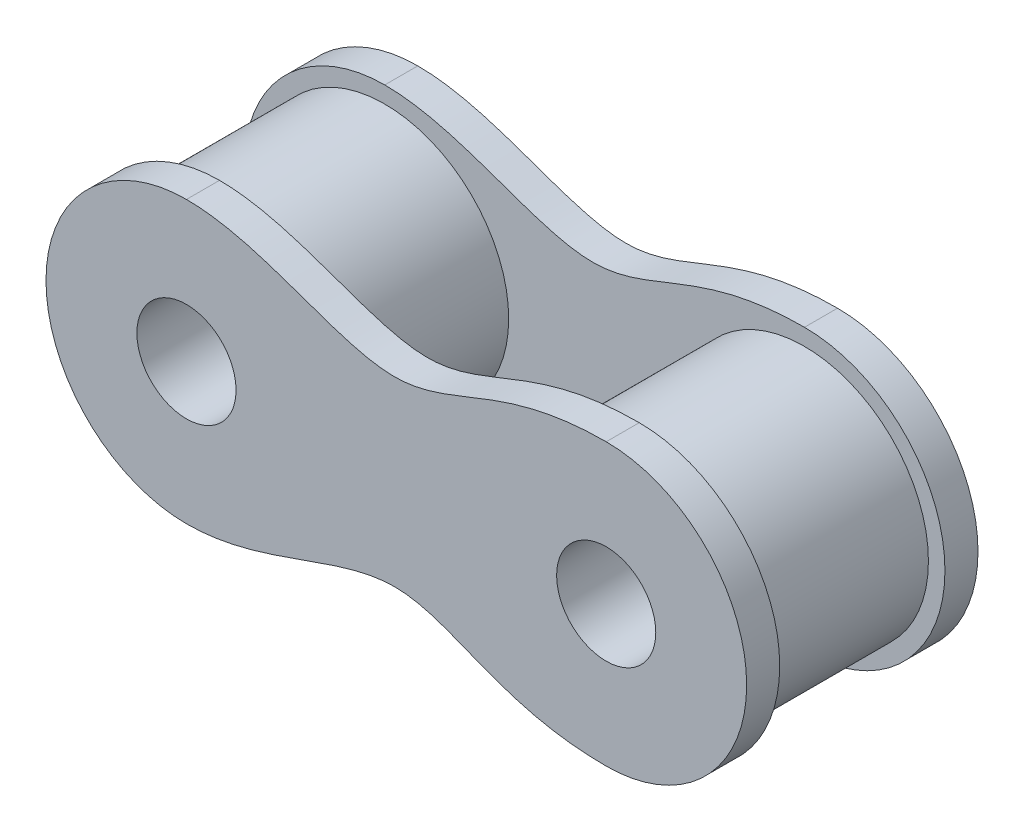
ISO-10303-21;
HEADER;
FILE_DESCRIPTION(('STEP AP214'),'2;1');
FILE_NAME('part.step','',(''),(''),'','','');
FILE_SCHEMA(('AUTOMOTIVE_DESIGN { 1 0 10303 214 1 1 1 1 }'));
ENDSEC;
DATA;
#1=APPLICATION_CONTEXT('core data for automotive mechanical design processes');
#2=APPLICATION_PROTOCOL_DEFINITION('international standard','automotive_design',2000,#1);
#3=PRODUCT_CONTEXT('',#1,'mechanical');
#4=PRODUCT('Part','Part','',(#3));
#5=PRODUCT_RELATED_PRODUCT_CATEGORY('part','',(#4));
#6=PRODUCT_DEFINITION_FORMATION('','',#4);
#7=PRODUCT_DEFINITION_CONTEXT('part definition',#1,'design');
#8=PRODUCT_DEFINITION('design','',#6,#7);
#9=PRODUCT_DEFINITION_SHAPE('','',#8);
#10=(LENGTH_UNIT() NAMED_UNIT(*) SI_UNIT(.MILLI.,.METRE.));
#11=(NAMED_UNIT(*) PLANE_ANGLE_UNIT() SI_UNIT($,.RADIAN.));
#12=(NAMED_UNIT(*) SI_UNIT($,.STERADIAN.) SOLID_ANGLE_UNIT());
#13=UNCERTAINTY_MEASURE_WITH_UNIT(LENGTH_MEASURE(1.E-05),#10,'distance_accuracy_value','');
#14=(GEOMETRIC_REPRESENTATION_CONTEXT(3) GLOBAL_UNCERTAINTY_ASSIGNED_CONTEXT((#13)) GLOBAL_UNIT_ASSIGNED_CONTEXT((#10,
#11,#12)) REPRESENTATION_CONTEXT('',''));
#15=CARTESIAN_POINT('',(0.,0.,0.));
#16=DIRECTION('',(0.,0.,1.));
#17=DIRECTION('',(1.,0.,0.));
#18=AXIS2_PLACEMENT_3D('',#15,#16,#17);
#19=CARTESIAN_POINT('',(6.3296493184956,-2.74999026126694,5.));
#20=DIRECTION('',(0.,0.,-1.));
#21=DIRECTION('',(-1.,0.,0.));
#22=AXIS2_PLACEMENT_3D('',#19,#20,#21);
#23=PLANE('',#22);
#24=CARTESIAN_POINT('',(0.,-4.25,5.));
#25=CARTESIAN_POINT('',(2.28904014641197,-4.25,5.));
#26=CARTESIAN_POINT('',(6.75768016733715,-1.24933243087643,5.));
#27=CARTESIAN_POINT('',(9.40838170625121,-4.25,5.));
#28=CARTESIAN_POINT('',(12.7,-4.25,5.));
#29=B_SPLINE_CURVE_WITH_KNOTS('',3,(#24,#25,#26,#27,#28),.UNSPECIFIED.,.F.,.F.,(4,1,4),(0.,
0.492542226610754,1.),.UNSPECIFIED.);
#30=CARTESIAN_POINT('',(0.,-4.25,5.));
#31=VERTEX_POINT('',#30);
#32=CARTESIAN_POINT('',(12.7,-4.25,5.));
#33=VERTEX_POINT('',#32);
#34=EDGE_CURVE('E208',#31,#33,#29,.T.);
#35=ORIENTED_EDGE('',*,*,#34,.F.);
#36=CARTESIAN_POINT('',(0.,0.,5.));
#37=DIRECTION('',(0.,0.,1.));
#38=DIRECTION('',(1.,0.,0.));
#39=AXIS2_PLACEMENT_3D('',#36,#37,#38);
#40=CIRCLE('',#39,4.25);
#41=CARTESIAN_POINT('',(0.,4.25,5.));
#42=VERTEX_POINT('',#41);
#43=EDGE_CURVE('E81',#42,#31,#40,.T.);
#44=ORIENTED_EDGE('',*,*,#43,.F.);
#45=CARTESIAN_POINT('',(12.7,4.25,5.));
#46=CARTESIAN_POINT('',(9.40838170625121,4.25,5.));
#47=CARTESIAN_POINT('',(6.75768016733715,1.24933243087643,5.));
#48=CARTESIAN_POINT('',(2.28904014641197,4.25,5.));
#49=CARTESIAN_POINT('',(0.,4.25,5.));
#50=B_SPLINE_CURVE_WITH_KNOTS('',3,(#45,#46,#47,#48,#49),.UNSPECIFIED.,.F.,.F.,(4,1,4),(0.,
0.507457773389246,1.),.UNSPECIFIED.);
#51=CARTESIAN_POINT('',(12.7,4.25,5.));
#52=VERTEX_POINT('',#51);
#53=EDGE_CURVE('E75',#52,#42,#50,.T.);
#54=ORIENTED_EDGE('',*,*,#53,.F.);
#55=CARTESIAN_POINT('',(12.7,0.,5.));
#56=DIRECTION('',(0.,0.,1.));
#57=DIRECTION('',(1.,0.,0.));
#58=AXIS2_PLACEMENT_3D('',#55,#56,#57);
#59=CIRCLE('',#58,4.25);
#60=EDGE_CURVE('E265',#33,#52,#59,.T.);
#61=ORIENTED_EDGE('',*,*,#60,.F.);
#62=EDGE_LOOP('',(#35,#44,#54,#61));
#63=FACE_BOUND('',#62,.T.);
#64=CARTESIAN_POINT('',(0.,0.,5.));
#65=DIRECTION('',(0.,0.,1.));
#66=DIRECTION('',(1.,0.,0.));
#67=AXIS2_PLACEMENT_3D('',#64,#65,#66);
#68=CIRCLE('',#67,3.75);
#69=CARTESIAN_POINT('',(3.75,0.,5.));
#70=VERTEX_POINT('',#69);
#71=EDGE_CURVE('E11',#70,#70,#68,.T.);
#72=ORIENTED_EDGE('',*,*,#71,.T.);
#73=EDGE_LOOP('',(#72));
#74=FACE_BOUND('',#73,.T.);
#75=CARTESIAN_POINT('',(12.7,0.,5.));
#76=DIRECTION('',(0.,0.,1.));
#77=DIRECTION('',(1.,0.,0.));
#78=AXIS2_PLACEMENT_3D('',#75,#76,#77);
#79=CIRCLE('',#78,3.75);
#80=CARTESIAN_POINT('',(16.45,0.,5.));
#81=VERTEX_POINT('',#80);
#82=EDGE_CURVE('E199',#81,#81,#79,.T.);
#83=ORIENTED_EDGE('',*,*,#82,.T.);
#84=EDGE_LOOP('',(#83));
#85=FACE_BOUND('',#84,.T.);
#86=ADVANCED_FACE('F39',(#63,#74,#85),#23,.T.);
#87=CARTESIAN_POINT('',(0.,0.,5.));
#88=DIRECTION('',(0.,0.,-1.));
#89=DIRECTION('',(-1.,0.,0.));
#90=AXIS2_PLACEMENT_3D('',#87,#88,#89);
#91=CYLINDRICAL_SURFACE('',#90,3.75);
#92=ORIENTED_EDGE('',*,*,#71,.F.);
#93=EDGE_LOOP('',(#92));
#94=FACE_BOUND('',#93,.T.);
#95=CARTESIAN_POINT('',(0.,0.,0.));
#96=DIRECTION('',(0.,0.,1.));
#97=DIRECTION('',(1.,0.,0.));
#98=AXIS2_PLACEMENT_3D('',#95,#96,#97);
#99=CIRCLE('',#98,3.75);
#100=CARTESIAN_POINT('',(3.75,0.,0.));
#101=VERTEX_POINT('',#100);
#102=EDGE_CURVE('E43',#101,#101,#99,.T.);
#103=ORIENTED_EDGE('',*,*,#102,.T.);
#104=EDGE_LOOP('',(#103));
#105=FACE_BOUND('',#104,.T.);
#106=ADVANCED_FACE('F41',(#94,#105),#91,.T.);
#107=CARTESIAN_POINT('',(0.,0.,5.));
#108=DIRECTION('',(0.,0.,-1.));
#109=DIRECTION('',(-1.,0.,0.));
#110=AXIS2_PLACEMENT_3D('',#107,#108,#109);
#111=CYLINDRICAL_SURFACE('',#110,1.5);
#112=CARTESIAN_POINT('',(0.,0.,6.));
#113=DIRECTION('',(0.,0.,1.));
#114=DIRECTION('',(1.,0.,0.));
#115=AXIS2_PLACEMENT_3D('',#112,#113,#114);
#116=CIRCLE('',#115,1.5);
#117=CARTESIAN_POINT('',(1.5,0.,6.));
#118=VERTEX_POINT('',#117);
#119=EDGE_CURVE('E202',#118,#118,#116,.T.);
#120=ORIENTED_EDGE('',*,*,#119,.T.);
#121=EDGE_LOOP('',(#120));
#122=FACE_BOUND('',#121,.T.);
#123=CARTESIAN_POINT('',(0.,0.,-1.));
#124=DIRECTION('',(0.,0.,-1.));
#125=DIRECTION('',(-1.,0.,0.));
#126=AXIS2_PLACEMENT_3D('',#123,#124,#125);
#127=CIRCLE('',#126,1.5);
#128=CARTESIAN_POINT('',(-1.5,0.,-1.));
#129=VERTEX_POINT('',#128);
#130=EDGE_CURVE('E173',#129,#129,#127,.T.);
#131=ORIENTED_EDGE('',*,*,#130,.T.);
#132=EDGE_LOOP('',(#131));
#133=FACE_BOUND('',#132,.T.);
#134=ADVANCED_FACE('F226',(#122,#133),#111,.F.);
#135=CARTESIAN_POINT('',(6.3296493184956,-2.74999026126694,6.));
#136=DIRECTION('',(0.,0.,-1.));
#137=DIRECTION('',(-1.,0.,0.));
#138=AXIS2_PLACEMENT_3D('',#135,#136,#137);
#139=PLANE('',#138);
#140=CARTESIAN_POINT('',(0.,-4.25,6.));
#141=CARTESIAN_POINT('',(2.28904014641197,-4.25,6.));
#142=CARTESIAN_POINT('',(6.75768016733715,-1.24933243087643,6.));
#143=CARTESIAN_POINT('',(9.40838170625121,-4.25,6.));
#144=CARTESIAN_POINT('',(12.7,-4.25,6.));
#145=B_SPLINE_CURVE_WITH_KNOTS('',3,(#140,#141,#142,#143,#144),.UNSPECIFIED.,.F.,.F.,(4,1,4),
(0.,0.492542226610754,1.),.UNSPECIFIED.);
#146=CARTESIAN_POINT('',(0.,-4.25,6.));
#147=VERTEX_POINT('',#146);
#148=CARTESIAN_POINT('',(12.7,-4.25,6.));
#149=VERTEX_POINT('',#148);
#150=EDGE_CURVE('E209',#147,#149,#145,.T.);
#151=ORIENTED_EDGE('',*,*,#150,.T.);
#152=CARTESIAN_POINT('',(12.7,0.,6.));
#153=DIRECTION('',(0.,0.,1.));
#154=DIRECTION('',(1.,0.,0.));
#155=AXIS2_PLACEMENT_3D('',#152,#153,#154);
#156=CIRCLE('',#155,4.25);
#157=CARTESIAN_POINT('',(12.7,4.25,6.));
#158=VERTEX_POINT('',#157);
#159=EDGE_CURVE('E89',#149,#158,#156,.T.);
#160=ORIENTED_EDGE('',*,*,#159,.T.);
#161=CARTESIAN_POINT('',(12.7,4.25,6.));
#162=CARTESIAN_POINT('',(9.40838170625121,4.25,6.));
#163=CARTESIAN_POINT('',(6.75768016733715,1.24933243087643,6.));
#164=CARTESIAN_POINT('',(2.28904014641197,4.25,6.));
#165=CARTESIAN_POINT('',(0.,4.25,6.));
#166=B_SPLINE_CURVE_WITH_KNOTS('',3,(#161,#162,#163,#164,#165),.UNSPECIFIED.,.F.,.F.,(4,1,4),
(0.,0.507457773389246,1.),.UNSPECIFIED.);
#167=CARTESIAN_POINT('',(0.,4.25,6.));
#168=VERTEX_POINT('',#167);
#169=EDGE_CURVE('E251',#158,#168,#166,.T.);
#170=ORIENTED_EDGE('',*,*,#169,.T.);
#171=CARTESIAN_POINT('',(0.,0.,6.));
#172=DIRECTION('',(0.,0.,1.));
#173=DIRECTION('',(1.,0.,0.));
#174=AXIS2_PLACEMENT_3D('',#171,#172,#173);
#175=CIRCLE('',#174,4.25);
#176=EDGE_CURVE('E57',#168,#147,#175,.T.);
#177=ORIENTED_EDGE('',*,*,#176,.T.);
#178=EDGE_LOOP('',(#151,#160,#170,#177));
#179=FACE_BOUND('',#178,.T.);
#180=CARTESIAN_POINT('',(12.7,0.,6.));
#181=DIRECTION('',(0.,0.,1.));
#182=DIRECTION('',(1.,0.,0.));
#183=AXIS2_PLACEMENT_3D('',#180,#181,#182);
#184=CIRCLE('',#183,1.5);
#185=CARTESIAN_POINT('',(14.2,0.,6.));
#186=VERTEX_POINT('',#185);
#187=EDGE_CURVE('E205',#186,#186,#184,.T.);
#188=ORIENTED_EDGE('',*,*,#187,.F.);
#189=EDGE_LOOP('',(#188));
#190=FACE_BOUND('',#189,.T.);
#191=ORIENTED_EDGE('',*,*,#119,.F.);
#192=EDGE_LOOP('',(#191));
#193=FACE_BOUND('',#192,.T.);
#194=ADVANCED_FACE('F223',(#179,#190,#193),#139,.F.);
#195=DIRECTION('',(0.,0.,-1.));
#196=VECTOR('',#195,1.);
#197=SURFACE_OF_LINEAR_EXTRUSION('',#145,#196);
#198=ORIENTED_EDGE('',*,*,#34,.T.);
#199=DIRECTION('',(0.,0.,-1.));
#200=VECTOR('',#199,1.);
#201=CARTESIAN_POINT('',(12.7,-4.25,6.));
#202=LINE('',#201,#200);
#203=EDGE_CURVE('E49',#149,#33,#202,.T.);
#204=ORIENTED_EDGE('',*,*,#203,.F.);
#205=ORIENTED_EDGE('',*,*,#150,.F.);
#206=DIRECTION('',(0.,0.,-1.));
#207=VECTOR('',#206,1.);
#208=CARTESIAN_POINT('',(0.,-4.25,6.));
#209=LINE('',#208,#207);
#210=EDGE_CURVE('E260',#147,#31,#209,.T.);
#211=ORIENTED_EDGE('',*,*,#210,.T.);
#212=EDGE_LOOP('',(#198,#204,#205,#211));
#213=FACE_BOUND('',#212,.T.);
#214=ADVANCED_FACE('F219',(#213),#197,.F.);
#215=CARTESIAN_POINT('',(12.7,0.,6.));
#216=DIRECTION('',(0.,0.,-1.));
#217=DIRECTION('',(-1.,0.,0.));
#218=AXIS2_PLACEMENT_3D('',#215,#216,#217);
#219=CYLINDRICAL_SURFACE('',#218,4.25);
#220=ORIENTED_EDGE('',*,*,#60,.T.);
#221=DIRECTION('',(0.,0.,-1.));
#222=VECTOR('',#221,1.);
#223=CARTESIAN_POINT('',(12.7,4.25,6.));
#224=LINE('',#223,#222);
#225=EDGE_CURVE('E280',#158,#52,#224,.T.);
#226=ORIENTED_EDGE('',*,*,#225,.F.);
#227=ORIENTED_EDGE('',*,*,#159,.F.);
#228=ORIENTED_EDGE('',*,*,#203,.T.);
#229=EDGE_LOOP('',(#220,#226,#227,#228));
#230=FACE_BOUND('',#229,.T.);
#231=ADVANCED_FACE('F222',(#230),#219,.T.);
#232=DIRECTION('',(0.,0.,-1.));
#233=VECTOR('',#232,1.);
#234=SURFACE_OF_LINEAR_EXTRUSION('',#166,#233);
#235=ORIENTED_EDGE('',*,*,#53,.T.);
#236=DIRECTION('',(0.,0.,-1.));
#237=VECTOR('',#236,1.);
#238=CARTESIAN_POINT('',(0.,4.25,6.));
#239=LINE('',#238,#237);
#240=EDGE_CURVE('E278',#168,#42,#239,.T.);
#241=ORIENTED_EDGE('',*,*,#240,.F.);
#242=ORIENTED_EDGE('',*,*,#169,.F.);
#243=ORIENTED_EDGE('',*,*,#225,.T.);
#244=EDGE_LOOP('',(#235,#241,#242,#243));
#245=FACE_BOUND('',#244,.T.);
#246=ADVANCED_FACE('F249',(#245),#234,.F.);
#247=CARTESIAN_POINT('',(0.,0.,6.));
#248=DIRECTION('',(0.,0.,-1.));
#249=DIRECTION('',(-1.,0.,0.));
#250=AXIS2_PLACEMENT_3D('',#247,#248,#249);
#251=CYLINDRICAL_SURFACE('',#250,4.25);
#252=ORIENTED_EDGE('',*,*,#43,.T.);
#253=ORIENTED_EDGE('',*,*,#210,.F.);
#254=ORIENTED_EDGE('',*,*,#176,.F.);
#255=ORIENTED_EDGE('',*,*,#240,.T.);
#256=EDGE_LOOP('',(#252,#253,#254,#255));
#257=FACE_BOUND('',#256,.T.);
#258=ADVANCED_FACE('F246',(#257),#251,.T.);
#259=CARTESIAN_POINT('',(12.7,0.,6.));
#260=DIRECTION('',(0.,0.,-1.));
#261=DIRECTION('',(-1.,0.,0.));
#262=AXIS2_PLACEMENT_3D('',#259,#260,#261);
#263=CYLINDRICAL_SURFACE('',#262,1.5);
#264=ORIENTED_EDGE('',*,*,#187,.T.);
#265=EDGE_LOOP('',(#264));
#266=FACE_BOUND('',#265,.T.);
#267=CARTESIAN_POINT('',(12.7,0.,-1.));
#268=DIRECTION('',(0.,0.,-1.));
#269=DIRECTION('',(-1.,0.,0.));
#270=AXIS2_PLACEMENT_3D('',#267,#268,#269);
#271=CIRCLE('',#270,1.5);
#272=CARTESIAN_POINT('',(11.2,0.,-1.));
#273=VERTEX_POINT('',#272);
#274=EDGE_CURVE('E293',#273,#273,#271,.T.);
#275=ORIENTED_EDGE('',*,*,#274,.T.);
#276=EDGE_LOOP('',(#275));
#277=FACE_BOUND('',#276,.T.);
#278=ADVANCED_FACE('F248',(#266,#277),#263,.F.);
#279=CARTESIAN_POINT('',(12.7,0.,5.));
#280=DIRECTION('',(0.,0.,-1.));
#281=DIRECTION('',(-1.,0.,0.));
#282=AXIS2_PLACEMENT_3D('',#279,#280,#281);
#283=CYLINDRICAL_SURFACE('',#282,3.75);
#284=ORIENTED_EDGE('',*,*,#82,.F.);
#285=EDGE_LOOP('',(#284));
#286=FACE_BOUND('',#285,.T.);
#287=CARTESIAN_POINT('',(12.7,0.,0.));
#288=DIRECTION('',(0.,0.,1.));
#289=DIRECTION('',(1.,0.,0.));
#290=AXIS2_PLACEMENT_3D('',#287,#288,#289);
#291=CIRCLE('',#290,3.75);
#292=CARTESIAN_POINT('',(16.45,0.,0.));
#293=VERTEX_POINT('',#292);
#294=EDGE_CURVE('E196',#293,#293,#291,.T.);
#295=ORIENTED_EDGE('',*,*,#294,.T.);
#296=EDGE_LOOP('',(#295));
#297=FACE_BOUND('',#296,.T.);
#298=ADVANCED_FACE('F183',(#286,#297),#283,.T.);
#299=CARTESIAN_POINT('',(6.3296493184956,-2.74999026126694,-1.));
#300=DIRECTION('',(0.,0.,-1.));
#301=DIRECTION('',(-1.,0.,0.));
#302=AXIS2_PLACEMENT_3D('',#299,#300,#301);
#303=PLANE('',#302);
#304=ORIENTED_EDGE('',*,*,#130,.F.);
#305=EDGE_LOOP('',(#304));
#306=FACE_BOUND('',#305,.T.);
#307=CARTESIAN_POINT('',(12.6999997339729,-4.25,-1.));
#308=CARTESIAN_POINT('',(12.5348293159263,-4.25002115708397,-1.));
#309=CARTESIAN_POINT('',(12.3696319923738,-4.24616826055417,-1.));
#310=CARTESIAN_POINT('',(12.0420798597001,-4.23036667693288,-1.));
#311=CARTESIAN_POINT('',(11.8797191627727,-4.21853863778645,-1.));
#312=CARTESIAN_POINT('',(11.5575861166124,-4.18663989149338,-1.));
#313=CARTESIAN_POINT('',(11.3978048402767,-4.16666039726443,-1.));
#314=CARTESIAN_POINT('',(11.0805862386774,-4.1184223218153,-1.));
#315=CARTESIAN_POINT('',(10.9231403869343,-4.09021988401323,-1.));
#316=CARTESIAN_POINT('',(10.6103259300822,-4.02564528020137,-1.));
#317=CARTESIAN_POINT('',(10.454953286962,-3.98929263045544,-1.));
#318=CARTESIAN_POINT('',(10.1322128526193,-3.90519246947487,-1.));
#319=CARTESIAN_POINT('',(9.96503724376868,-3.85670991584743,-1.));
#320=CARTESIAN_POINT('',(9.63289030644149,-3.75171052063862,-1.));
#321=CARTESIAN_POINT('',(9.46792405957768,-3.69517779254271,-1.));
#322=CARTESIAN_POINT('',(9.13971281254738,-3.57614587475493,-1.));
#323=CARTESIAN_POINT('',(8.97647331660335,-3.5136317444653,-1.));
#324=CARTESIAN_POINT('',(8.65080406129563,-3.38585798522027,-1.));
#325=CARTESIAN_POINT('',(8.48837598436485,-3.32059418301813,-1.));
#326=CARTESIAN_POINT('',(8.16283886747149,-3.19193867144577,-1.));
#327=CARTESIAN_POINT('',(7.99973020812282,-3.12854604336203,-1.));
#328=CARTESIAN_POINT('',(7.71007663731721,-3.0240537840555,-1.));
#329=CARTESIAN_POINT('',(7.58416037008993,-2.98125698262255,-1.));
#330=CARTESIAN_POINT('',(7.32994084042476,-2.90375468564638,-1.));
#331=CARTESIAN_POINT('',(7.20164057308007,-2.86903969268599,-1.));
#332=CARTESIAN_POINT('',(6.94599406365266,-2.8121604151261,-1.));
#333=CARTESIAN_POINT('',(6.81872297681856,-2.78966975797567,-1.));
#334=CARTESIAN_POINT('',(6.56244374230435,-2.75875435108949,-1.));
#335=CARTESIAN_POINT('',(6.43343666309306,-2.750321315506,-1.));
#336=CARTESIAN_POINT('',(6.21807478345362,-2.74941756234462,-1.));
#337=CARTESIAN_POINT('',(6.13171586155183,-2.75259220213708,-1.));
#338=CARTESIAN_POINT('',(5.95937508572185,-2.76500313866876,-1.));
#339=CARTESIAN_POINT('',(5.87339366833504,-2.77424519545718,-1.));
#340=CARTESIAN_POINT('',(5.70208714220143,-2.79762998203682,-1.));
#341=CARTESIAN_POINT('',(5.61676230344003,-2.81177462809172,-1.));
#342=CARTESIAN_POINT('',(5.44432634762305,-2.84449713322205,-1.));
#343=CARTESIAN_POINT('',(5.35723843432903,-2.8631952582437,-1.));
#344=CARTESIAN_POINT('',(5.18389467704501,-2.90388082665409,-1.));
#345=CARTESIAN_POINT('',(5.09763841144388,-2.92586649871998,-1.));
#346=CARTESIAN_POINT('',(4.92581487806223,-2.97240897555418,-1.));
#347=CARTESIAN_POINT('',(4.84024771887111,-2.99696617732532,-1.));
#348=CARTESIAN_POINT('',(4.59035673211516,-3.07177321884254,-1.));
#349=CARTESIAN_POINT('',(4.42683128782199,-3.12466897573429,-1.));
#350=CARTESIAN_POINT('',(4.10098129676159,-3.23421021251448,-1.));
#351=CARTESIAN_POINT('',(3.93865743898908,-3.29085768258474,-1.));
#352=CARTESIAN_POINT('',(3.61439257514913,-3.40518850628353,-1.));
#353=CARTESIAN_POINT('',(3.45245153792612,-3.46287177208236,-1.));
#354=CARTESIAN_POINT('',(3.12829005660151,-3.57692346030838,-1.));
#355=CARTESIAN_POINT('',(2.96607007413914,-3.63329317981757,-1.));
#356=CARTESIAN_POINT('',(2.64075213052934,-3.74256744631952,-1.));
#357=CARTESIAN_POINT('',(2.47765609665734,-3.79547764285633,-1.));
#358=CARTESIAN_POINT('',(2.16454217255338,-3.8912972475008,-1.));
#359=CARTESIAN_POINT('',(2.01467032776043,-3.93467821171736,-1.));
#360=CARTESIAN_POINT('',(1.71323740075894,-4.01522782316057,-1.));
#361=CARTESIAN_POINT('',(1.56167628516923,-4.05239634739207,-1.));
#362=CARTESIAN_POINT('',(1.25637423609742,-4.11881442946265,-1.));
#363=CARTESIAN_POINT('',(1.10262853400063,-4.14804240670999,-1.));
#364=CARTESIAN_POINT('',(0.79239674559594,-4.19668549901426,-1.));
#365=CARTESIAN_POINT('',(0.635898897942498,-4.21602843157468,-1.));
#366=CARTESIAN_POINT('',(0.319668813832844,-4.24278601063487,-1.));
#367=CARTESIAN_POINT('',(0.159922239465159,-4.25002702396675,-1.));
#368=CARTESIAN_POINT('',(2.35792321472822E-07,-4.24999999999999,-1.));
#369=B_SPLINE_CURVE_WITH_KNOTS('',3,(#307,#308,#309,#310,#311,#312,#313,#314,#315,#316,#317,
#318,#319,#320,#321,#322,#323,#324,#325,#326,#327,#328,#329,#330,#331,#332,#333,#334,#335,#336,
#337,#338,#339,#340,#341,#342,#343,#344,#345,#346,#347,#348,#349,#350,#351,#352,#353,#354,#355,
#356,#357,#358,#359,#360,#361,#362,#363,#364,#365,#366,#367,#368),.UNSPECIFIED.,.F.,.F.,(4,2,2,
2,2,2,2,2,2,2,2,2,2,2,2,2,2,2,2,2,2,2,2,2,2,2,2,2,2,2,4),(0.,0.49550496633463,0.983677285651908,
1.46653067756328,1.94616157038471,2.4246559922801,2.94660803949097,3.46960478094167,
3.9939437982054,4.51910950542195,5.04401292535663,5.44282785326908,5.84117171705168,
6.2282804289261,6.61516089027838,6.87416845373573,7.13342226001487,7.39277751471621,
7.65991340803315,7.92690588433289,8.19393964091829,8.70943114807115,9.22519833432191,
9.74092199100269,10.2561127317604,10.7704399725641,11.2384146352738,11.7063985619443,
12.1756419197078,12.6482645041535,13.127611631216),.UNSPECIFIED.);
#370=CARTESIAN_POINT('',(12.6999997339729,-4.25,-1.));
#371=VERTEX_POINT('',#370);
#372=CARTESIAN_POINT('',(2.35792321958367E-07,-4.25,-1.));
#373=VERTEX_POINT('',#372);
#374=EDGE_CURVE('E141',#371,#373,#369,.T.);
#375=ORIENTED_EDGE('',*,*,#374,.T.);
#376=CARTESIAN_POINT('',(0.,0.,-1.));
#377=DIRECTION('',(0.,0.,-1.));
#378=DIRECTION('',(-1.,0.,0.));
#379=AXIS2_PLACEMENT_3D('',#376,#377,#378);
#380=CIRCLE('',#379,4.25);
#381=CARTESIAN_POINT('',(2.45573587055553E-07,4.24999999999999,-1.));
#382=VERTEX_POINT('',#381);
#383=EDGE_CURVE('E193',#373,#382,#380,.T.);
#384=ORIENTED_EDGE('',*,*,#383,.T.);
#385=CARTESIAN_POINT('',(2.45573587055553E-07,4.24999999999999,-1.));
#386=CARTESIAN_POINT('',(0.161683768120444,4.25002773980227,-1.));
#387=CARTESIAN_POINT('',(0.323184224748464,4.24262619943971,-1.));
#388=CARTESIAN_POINT('',(0.642813124085388,4.21530366679236,-1.));
#389=CARTESIAN_POINT('',(0.800956686702212,4.19556397273925,-1.));
#390=CARTESIAN_POINT('',(1.11439732657357,4.14596290302014,-1.));
#391=CARTESIAN_POINT('',(1.26970676567288,4.1161766617297,-1.));
#392=CARTESIAN_POINT('',(1.57808212324226,4.04853881934818,-1.));
#393=CARTESIAN_POINT('',(1.7311530459198,4.01070967692007,-1.));
#394=CARTESIAN_POINT('',(2.03557601540453,3.92878563653626,-1.));
#395=CARTESIAN_POINT('',(2.18692812465035,3.88469096697708,-1.));
#396=CARTESIAN_POINT('',(2.50711512678364,3.78614290106484,-1.));
#397=CARTESIAN_POINT('',(2.67576136134042,3.73108394913203,-1.));
#398=CARTESIAN_POINT('',(3.01217263506816,3.61745462790027,-1.));
#399=CARTESIAN_POINT('',(3.17993564158027,3.55887834081663,-1.));
#400=CARTESIAN_POINT('',(3.51525687292048,3.44059570431954,-1.));
#401=CARTESIAN_POINT('',(3.6828146961281,3.38088822995767,-1.));
#402=CARTESIAN_POINT('',(4.01848567462939,3.26298176488594,-1.));
#403=CARTESIAN_POINT('',(4.18659888601842,3.20478293215163,-1.));
#404=CARTESIAN_POINT('',(4.5243382490143,3.09300662751021,-1.));
#405=CARTESIAN_POINT('',(4.69396387607702,3.03942761724131,-1.));
#406=CARTESIAN_POINT('',(5.00522795605709,2.94977971439265,-1.));
#407=CARTESIAN_POINT('',(5.14645110578683,2.91229273120285,-1.));
#408=CARTESIAN_POINT('',(5.43106744460508,2.84629509785346,-1.));
#409=CARTESIAN_POINT('',(5.57446024326604,2.81778285236177,-1.));
#410=CARTESIAN_POINT('',(5.78862212943186,2.78528345568821,-1.));
#411=CARTESIAN_POINT('',(5.85862313536747,2.77623700363775,-1.));
#412=CARTESIAN_POINT('',(5.99901103916404,2.76181807353698,-1.));
#413=CARTESIAN_POINT('',(6.06939788481146,2.75644511017032,-1.));
#414=CARTESIAN_POINT('',(6.17508298503703,2.75161884437926,-1.));
#415=CARTESIAN_POINT('',(6.21031063500662,2.75054867233182,-1.));
#416=CARTESIAN_POINT('',(6.28078182526375,2.7495690853574,-1.));
#417=CARTESIAN_POINT('',(6.31602536554191,2.74965966974605,-1.));
#418=CARTESIAN_POINT('',(6.42171858783247,2.75166224086853,-1.));
#419=CARTESIAN_POINT('',(6.49214378468451,2.75530444497559,-0.999999999999998));
#420=CARTESIAN_POINT('',(6.60966546093407,2.7650674156407,-0.999999999999999));
#421=CARTESIAN_POINT('',(6.65686793984669,2.76998994823739,-1.));
#422=CARTESIAN_POINT('',(6.75103521644809,2.78171075744451,-1.));
#423=CARTESIAN_POINT('',(6.79800003218253,2.7885088893975,-1.));
#424=CARTESIAN_POINT('',(6.93860030622277,2.81154816014528,-1.));
#425=CARTESIAN_POINT('',(7.03181017210705,2.83042260378371,-1.));
#426=CARTESIAN_POINT('',(7.21687855925384,2.87392837755156,-1.));
#427=CARTESIAN_POINT('',(7.30873649439859,2.89856213071937,-1.));
#428=CARTESIAN_POINT('',(7.493263606122,2.95285248330521,-1.));
#429=CARTESIAN_POINT('',(7.58590184819456,2.98261270551004,-1.));
#430=CARTESIAN_POINT('',(7.76999918519206,3.04533698963576,-1.));
#431=CARTESIAN_POINT('',(7.8614590373221,3.07829886466403,-1.));
#432=CARTESIAN_POINT('',(8.04366137969972,3.14623954897005,-1.));
#433=CARTESIAN_POINT('',(8.13440355362156,3.18121919679057,-1.));
#434=CARTESIAN_POINT('',(8.38016271938993,3.27741393365439,-1.));
#435=CARTESIAN_POINT('',(8.53482124862511,3.33953202577535,-1.));
#436=CARTESIAN_POINT('',(8.84471386336267,3.46226481798995,-1.));
#437=CARTESIAN_POINT('',(8.99994784954362,3.52287976479299,-1.));
#438=CARTESIAN_POINT('',(9.31201396073957,3.63952692105763,-1.));
#439=CARTESIAN_POINT('',(9.46884468742431,3.69556280758841,-1.));
#440=CARTESIAN_POINT('',(9.78473993490272,3.80095507454315,-1.));
#441=CARTESIAN_POINT('',(9.94380418858877,3.85031224629099,-1.));
#442=CARTESIAN_POINT('',(10.2615955130069,3.94022593990465,-1.));
#443=CARTESIAN_POINT('',(10.4202851885577,3.98091372761185,-1.));
#444=CARTESIAN_POINT('',(10.7398078155861,4.05382290857682,-1.));
#445=CARTESIAN_POINT('',(10.9006431379713,4.08603394979375,-1.));
#446=CARTESIAN_POINT('',(11.2238414073511,4.14168947053722,-1.));
#447=CARTESIAN_POINT('',(11.3862045372493,4.16513288638818,-1.));
#448=CARTESIAN_POINT('',(11.7117867578691,4.20335373526397,-1.));
#449=CARTESIAN_POINT('',(11.8750048639984,4.21813956359174,-1.));
#450=CARTESIAN_POINT('',(12.1482449403334,4.23594919334546,-1.));
#451=CARTESIAN_POINT('',(12.258126224403,4.24124133889405,-1.));
#452=CARTESIAN_POINT('',(12.4786715054418,4.24827884610311,-1.));
#453=CARTESIAN_POINT('',(12.5893362018653,4.25000246385124,-1.));
#454=CARTESIAN_POINT('',(12.6999998057907,4.25,-1.));
#455=B_SPLINE_CURVE_WITH_KNOTS('',3,(#385,#386,#387,#388,#389,#390,#391,#392,#393,#394,#395,
#396,#397,#398,#399,#400,#401,#402,#403,#404,#405,#406,#407,#408,#409,#410,#411,#412,#413,#414,
#415,#416,#417,#418,#419,#420,#421,#422,#423,#424,#425,#426,#427,#428,#429,#430,#431,#432,#433,
#434,#435,#436,#437,#438,#439,#440,#441,#442,#443,#444,#445,#446,#447,#448,#449,#450,#451,#452,
#453,#454),.UNSPECIFIED.,.F.,.F.,(4,2,2,2,2,2,2,2,2,2,2,2,2,2,2,2,2,2,2,2,2,2,2,2,2,2,2,2,2,2,2,
2,2,2,4),(0.,0.484615186674102,0.9622715796607,1.43643217175371,1.90928573014284,
2.38212205607621,2.91427429313079,3.44734840647525,3.98098381651691,4.5146748816382,
5.04818754024523,5.48636411839679,5.92446276307869,6.13613843385391,6.34778613407079,
6.45350103670308,6.55921587700647,6.77060685014621,6.91294750373993,7.05527718223878,
7.34033124622663,7.6255054537499,7.917321562761,8.2089397296902,8.50067997236106,
9.00068112809227,9.50059966869459,10.0001127377997,10.4995665704499,10.9908147328029,
11.482660066062,11.9745650499412,12.4659922378996,12.7959639198226,13.1279403524416),.UNSPECIFIED.);
#456=CARTESIAN_POINT('',(12.6999998057907,4.25,-1.));
#457=VERTEX_POINT('',#456);
#458=EDGE_CURVE('E134',#382,#457,#455,.T.);
#459=ORIENTED_EDGE('',*,*,#458,.T.);
#460=CARTESIAN_POINT('',(12.7,0.,-1.));
#461=DIRECTION('',(0.,0.,-1.));
#462=DIRECTION('',(-1.,0.,0.));
#463=AXIS2_PLACEMENT_3D('',#460,#461,#462);
#464=CIRCLE('',#463,4.25);
#465=EDGE_CURVE('E300',#457,#371,#464,.T.);
#466=ORIENTED_EDGE('',*,*,#465,.T.);
#467=EDGE_LOOP('',(#375,#384,#459,#466));
#468=FACE_BOUND('',#467,.T.);
#469=ORIENTED_EDGE('',*,*,#274,.F.);
#470=EDGE_LOOP('',(#469));
#471=FACE_BOUND('',#470,.T.);
#472=ADVANCED_FACE('F161',(#306,#468,#471),#303,.T.);
#473=CARTESIAN_POINT('',(6.3296493184956,-2.74999026126694,0.));
#474=DIRECTION('',(0.,0.,-1.));
#475=DIRECTION('',(-1.,0.,0.));
#476=AXIS2_PLACEMENT_3D('',#473,#474,#475);
#477=PLANE('',#476);
#478=ORIENTED_EDGE('',*,*,#102,.F.);
#479=EDGE_LOOP('',(#478));
#480=FACE_BOUND('',#479,.T.);
#481=ORIENTED_EDGE('',*,*,#294,.F.);
#482=EDGE_LOOP('',(#481));
#483=FACE_BOUND('',#482,.T.);
#484=CARTESIAN_POINT('',(12.6999997339729,-4.25,0.));
#485=CARTESIAN_POINT('',(12.5348293159263,-4.25002115708397,0.));
#486=CARTESIAN_POINT('',(12.3696319923738,-4.24616826055417,0.));
#487=CARTESIAN_POINT('',(12.0420798597001,-4.23036667693288,0.));
#488=CARTESIAN_POINT('',(11.8797191627727,-4.21853863778645,0.));
#489=CARTESIAN_POINT('',(11.5575861166124,-4.18663989149338,0.));
#490=CARTESIAN_POINT('',(11.3978048402767,-4.16666039726443,0.));
#491=CARTESIAN_POINT('',(11.0805862386774,-4.1184223218153,0.));
#492=CARTESIAN_POINT('',(10.9231403869343,-4.09021988401323,0.));
#493=CARTESIAN_POINT('',(10.6103259300822,-4.02564528020137,0.));
#494=CARTESIAN_POINT('',(10.454953286962,-3.98929263045544,0.));
#495=CARTESIAN_POINT('',(10.1322128526193,-3.90519246947487,0.));
#496=CARTESIAN_POINT('',(9.96503724376868,-3.85670991584743,0.));
#497=CARTESIAN_POINT('',(9.63289030644149,-3.75171052063862,0.));
#498=CARTESIAN_POINT('',(9.46792405957768,-3.69517779254271,0.));
#499=CARTESIAN_POINT('',(9.13971281254738,-3.57614587475493,0.));
#500=CARTESIAN_POINT('',(8.97647331660335,-3.5136317444653,0.));
#501=CARTESIAN_POINT('',(8.65080406129563,-3.38585798522027,0.));
#502=CARTESIAN_POINT('',(8.48837598436485,-3.32059418301813,0.));
#503=CARTESIAN_POINT('',(8.16283886747149,-3.19193867144577,0.));
#504=CARTESIAN_POINT('',(7.99973020812282,-3.12854604336203,0.));
#505=CARTESIAN_POINT('',(7.71007663731721,-3.0240537840555,0.));
#506=CARTESIAN_POINT('',(7.58416037008993,-2.98125698262255,0.));
#507=CARTESIAN_POINT('',(7.32994084042476,-2.90375468564638,0.));
#508=CARTESIAN_POINT('',(7.20164057308007,-2.86903969268599,0.));
#509=CARTESIAN_POINT('',(6.94599406365266,-2.8121604151261,0.));
#510=CARTESIAN_POINT('',(6.81872297681856,-2.78966975797567,0.));
#511=CARTESIAN_POINT('',(6.56244374230435,-2.75875435108949,0.));
#512=CARTESIAN_POINT('',(6.43343666309306,-2.750321315506,0.));
#513=CARTESIAN_POINT('',(6.21807478345362,-2.74941756234462,0.));
#514=CARTESIAN_POINT('',(6.13171586155183,-2.75259220213708,0.));
#515=CARTESIAN_POINT('',(5.95937508572185,-2.76500313866876,0.));
#516=CARTESIAN_POINT('',(5.87339366833504,-2.77424519545718,0.));
#517=CARTESIAN_POINT('',(5.70208714220143,-2.79762998203682,0.));
#518=CARTESIAN_POINT('',(5.61676230344003,-2.81177462809172,0.));
#519=CARTESIAN_POINT('',(5.44432634762305,-2.84449713322205,0.));
#520=CARTESIAN_POINT('',(5.35723843432903,-2.8631952582437,0.));
#521=CARTESIAN_POINT('',(5.18389467704501,-2.90388082665409,0.));
#522=CARTESIAN_POINT('',(5.09763841144388,-2.92586649871998,0.));
#523=CARTESIAN_POINT('',(4.92581487806223,-2.97240897555418,0.));
#524=CARTESIAN_POINT('',(4.84024771887111,-2.99696617732532,0.));
#525=CARTESIAN_POINT('',(4.59035673211516,-3.07177321884254,0.));
#526=CARTESIAN_POINT('',(4.42683128782199,-3.12466897573429,0.));
#527=CARTESIAN_POINT('',(4.10098129676159,-3.23421021251448,0.));
#528=CARTESIAN_POINT('',(3.93865743898908,-3.29085768258474,0.));
#529=CARTESIAN_POINT('',(3.61439257514913,-3.40518850628353,0.));
#530=CARTESIAN_POINT('',(3.45245153792612,-3.46287177208236,0.));
#531=CARTESIAN_POINT('',(3.12829005660151,-3.57692346030838,0.));
#532=CARTESIAN_POINT('',(2.96607007413914,-3.63329317981757,0.));
#533=CARTESIAN_POINT('',(2.64075213052934,-3.74256744631952,0.));
#534=CARTESIAN_POINT('',(2.47765609665734,-3.79547764285633,0.));
#535=CARTESIAN_POINT('',(2.16454217255338,-3.8912972475008,0.));
#536=CARTESIAN_POINT('',(2.01467032776043,-3.93467821171736,0.));
#537=CARTESIAN_POINT('',(1.71323740075894,-4.01522782316057,0.));
#538=CARTESIAN_POINT('',(1.56167628516923,-4.05239634739207,0.));
#539=CARTESIAN_POINT('',(1.25637423609742,-4.11881442946265,0.));
#540=CARTESIAN_POINT('',(1.10262853400063,-4.14804240670999,0.));
#541=CARTESIAN_POINT('',(0.79239674559594,-4.19668549901426,0.));
#542=CARTESIAN_POINT('',(0.635898897942498,-4.21602843157468,0.));
#543=CARTESIAN_POINT('',(0.319668813832844,-4.24278601063487,0.));
#544=CARTESIAN_POINT('',(0.159922239465159,-4.25002702396675,0.));
#545=CARTESIAN_POINT('',(2.35792321472822E-07,-4.24999999999999,0.));
#546=B_SPLINE_CURVE_WITH_KNOTS('',3,(#484,#485,#486,#487,#488,#489,#490,#491,#492,#493,#494,
#495,#496,#497,#498,#499,#500,#501,#502,#503,#504,#505,#506,#507,#508,#509,#510,#511,#512,#513,
#514,#515,#516,#517,#518,#519,#520,#521,#522,#523,#524,#525,#526,#527,#528,#529,#530,#531,#532,
#533,#534,#535,#536,#537,#538,#539,#540,#541,#542,#543,#544,#545),.UNSPECIFIED.,.F.,.F.,(4,2,2,
2,2,2,2,2,2,2,2,2,2,2,2,2,2,2,2,2,2,2,2,2,2,2,2,2,2,2,4),(0.,0.49550496633463,0.983677285651908,
1.46653067756328,1.94616157038471,2.4246559922801,2.94660803949097,3.46960478094167,
3.9939437982054,4.51910950542195,5.04401292535663,5.44282785326908,5.84117171705168,
6.2282804289261,6.61516089027838,6.87416845373573,7.13342226001487,7.39277751471621,
7.65991340803315,7.92690588433289,8.19393964091829,8.70943114807115,9.22519833432191,
9.74092199100269,10.2561127317604,10.7704399725641,11.2384146352738,11.7063985619443,
12.1756419197078,12.6482645041535,13.127611631216),.UNSPECIFIED.);
#547=CARTESIAN_POINT('',(12.6999997339729,-4.25,0.));
#548=VERTEX_POINT('',#547);
#549=CARTESIAN_POINT('',(2.35792321958367E-07,-4.25,0.));
#550=VERTEX_POINT('',#549);
#551=EDGE_CURVE('E128',#548,#550,#546,.T.);
#552=ORIENTED_EDGE('',*,*,#551,.F.);
#553=CARTESIAN_POINT('',(12.7,0.,0.));
#554=DIRECTION('',(0.,0.,-1.));
#555=DIRECTION('',(-1.,0.,0.));
#556=AXIS2_PLACEMENT_3D('',#553,#554,#555);
#557=CIRCLE('',#556,4.25);
#558=CARTESIAN_POINT('',(12.6999998057907,4.25,0.));
#559=VERTEX_POINT('',#558);
#560=EDGE_CURVE('E139',#559,#548,#557,.T.);
#561=ORIENTED_EDGE('',*,*,#560,.F.);
#562=CARTESIAN_POINT('',(2.45573587055553E-07,4.24999999999999,0.));
#563=CARTESIAN_POINT('',(0.161683768120444,4.25002773980227,0.));
#564=CARTESIAN_POINT('',(0.323184224748464,4.24262619943971,0.));
#565=CARTESIAN_POINT('',(0.642813124085388,4.21530366679236,0.));
#566=CARTESIAN_POINT('',(0.800956686702212,4.19556397273925,0.));
#567=CARTESIAN_POINT('',(1.11439732657357,4.14596290302014,0.));
#568=CARTESIAN_POINT('',(1.26970676567288,4.1161766617297,0.));
#569=CARTESIAN_POINT('',(1.57808212324226,4.04853881934818,0.));
#570=CARTESIAN_POINT('',(1.7311530459198,4.01070967692007,0.));
#571=CARTESIAN_POINT('',(2.03557601540453,3.92878563653626,0.));
#572=CARTESIAN_POINT('',(2.18692812465035,3.88469096697708,0.));
#573=CARTESIAN_POINT('',(2.50711512678364,3.78614290106484,0.));
#574=CARTESIAN_POINT('',(2.67576136134042,3.73108394913203,0.));
#575=CARTESIAN_POINT('',(3.01217263506816,3.61745462790027,0.));
#576=CARTESIAN_POINT('',(3.17993564158027,3.55887834081663,0.));
#577=CARTESIAN_POINT('',(3.51525687292048,3.44059570431954,0.));
#578=CARTESIAN_POINT('',(3.6828146961281,3.38088822995767,0.));
#579=CARTESIAN_POINT('',(4.01848567462939,3.26298176488594,0.));
#580=CARTESIAN_POINT('',(4.18659888601842,3.20478293215163,0.));
#581=CARTESIAN_POINT('',(4.5243382490143,3.09300662751021,0.));
#582=CARTESIAN_POINT('',(4.69396387607702,3.03942761724131,0.));
#583=CARTESIAN_POINT('',(5.00522795605709,2.94977971439265,0.));
#584=CARTESIAN_POINT('',(5.14645110578683,2.91229273120285,0.));
#585=CARTESIAN_POINT('',(5.43106744460508,2.84629509785346,0.));
#586=CARTESIAN_POINT('',(5.57446024326604,2.81778285236177,0.));
#587=CARTESIAN_POINT('',(5.78862212943186,2.78528345568821,0.));
#588=CARTESIAN_POINT('',(5.85862313536747,2.77623700363775,0.));
#589=CARTESIAN_POINT('',(5.99901103916404,2.76181807353698,0.));
#590=CARTESIAN_POINT('',(6.06939788481146,2.75644511017032,0.));
#591=CARTESIAN_POINT('',(6.17508298503703,2.75161884437926,0.));
#592=CARTESIAN_POINT('',(6.21031063500662,2.75054867233182,0.));
#593=CARTESIAN_POINT('',(6.28078182526375,2.7495690853574,0.));
#594=CARTESIAN_POINT('',(6.31602536554191,2.74965966974605,0.));
#595=CARTESIAN_POINT('',(6.42171858783247,2.75166224086853,0.));
#596=CARTESIAN_POINT('',(6.49214378468451,2.75530444497559,0.));
#597=CARTESIAN_POINT('',(6.60966546093407,2.7650674156407,0.));
#598=CARTESIAN_POINT('',(6.65686793984669,2.76998994823739,0.));
#599=CARTESIAN_POINT('',(6.75103521644809,2.78171075744451,0.));
#600=CARTESIAN_POINT('',(6.79800003218253,2.7885088893975,0.));
#601=CARTESIAN_POINT('',(6.93860030622277,2.81154816014528,0.));
#602=CARTESIAN_POINT('',(7.03181017210705,2.83042260378371,0.));
#603=CARTESIAN_POINT('',(7.21687855925384,2.87392837755156,0.));
#604=CARTESIAN_POINT('',(7.30873649439859,2.89856213071937,0.));
#605=CARTESIAN_POINT('',(7.493263606122,2.95285248330521,0.));
#606=CARTESIAN_POINT('',(7.58590184819456,2.98261270551004,0.));
#607=CARTESIAN_POINT('',(7.76999918519206,3.04533698963576,0.));
#608=CARTESIAN_POINT('',(7.8614590373221,3.07829886466403,0.));
#609=CARTESIAN_POINT('',(8.04366137969972,3.14623954897005,0.));
#610=CARTESIAN_POINT('',(8.13440355362156,3.18121919679057,0.));
#611=CARTESIAN_POINT('',(8.38016271938993,3.27741393365439,0.));
#612=CARTESIAN_POINT('',(8.53482124862511,3.33953202577535,0.));
#613=CARTESIAN_POINT('',(8.84471386336267,3.46226481798995,0.));
#614=CARTESIAN_POINT('',(8.99994784954362,3.52287976479299,0.));
#615=CARTESIAN_POINT('',(9.31201396073957,3.63952692105763,0.));
#616=CARTESIAN_POINT('',(9.46884468742431,3.69556280758841,0.));
#617=CARTESIAN_POINT('',(9.78473993490272,3.80095507454315,0.));
#618=CARTESIAN_POINT('',(9.94380418858877,3.85031224629099,0.));
#619=CARTESIAN_POINT('',(10.2615955130069,3.94022593990465,0.));
#620=CARTESIAN_POINT('',(10.4202851885577,3.98091372761185,0.));
#621=CARTESIAN_POINT('',(10.7398078155861,4.05382290857682,0.));
#622=CARTESIAN_POINT('',(10.9006431379713,4.08603394979375,0.));
#623=CARTESIAN_POINT('',(11.2238414073511,4.14168947053722,0.));
#624=CARTESIAN_POINT('',(11.3862045372493,4.16513288638818,0.));
#625=CARTESIAN_POINT('',(11.7117867578691,4.20335373526397,0.));
#626=CARTESIAN_POINT('',(11.8750048639984,4.21813956359174,0.));
#627=CARTESIAN_POINT('',(12.1482449403334,4.23594919334546,0.));
#628=CARTESIAN_POINT('',(12.258126224403,4.24124133889405,0.));
#629=CARTESIAN_POINT('',(12.4786715054418,4.24827884610311,0.));
#630=CARTESIAN_POINT('',(12.5893362018653,4.25000246385124,0.));
#631=CARTESIAN_POINT('',(12.6999998057907,4.25,0.));
#632=B_SPLINE_CURVE_WITH_KNOTS('',3,(#562,#563,#564,#565,#566,#567,#568,#569,#570,#571,#572,
#573,#574,#575,#576,#577,#578,#579,#580,#581,#582,#583,#584,#585,#586,#587,#588,#589,#590,#591,
#592,#593,#594,#595,#596,#597,#598,#599,#600,#601,#602,#603,#604,#605,#606,#607,#608,#609,#610,
#611,#612,#613,#614,#615,#616,#617,#618,#619,#620,#621,#622,#623,#624,#625,#626,#627,#628,#629,
#630,#631),.UNSPECIFIED.,.F.,.F.,(4,2,2,2,2,2,2,2,2,2,2,2,2,2,2,2,2,2,2,2,2,2,2,2,2,2,2,2,2,2,2,
2,2,2,4),(0.,0.484615186674102,0.9622715796607,1.43643217175371,1.90928573014284,
2.38212205607621,2.91427429313079,3.44734840647525,3.98098381651691,4.5146748816382,
5.04818754024523,5.48636411839679,5.92446276307869,6.13613843385391,6.34778613407079,
6.45350103670308,6.55921587700647,6.77060685014621,6.91294750373993,7.05527718223878,
7.34033124622663,7.6255054537499,7.917321562761,8.2089397296902,8.50067997236106,
9.00068112809227,9.50059966869459,10.0001127377997,10.4995665704499,10.9908147328029,
11.482660066062,11.9745650499412,12.4659922378996,12.7959639198226,13.1279403524416),.UNSPECIFIED.);
#633=CARTESIAN_POINT('',(2.45573587055553E-07,4.24999999999999,0.));
#634=VERTEX_POINT('',#633);
#635=EDGE_CURVE('E127',#634,#559,#632,.T.);
#636=ORIENTED_EDGE('',*,*,#635,.F.);
#637=CARTESIAN_POINT('',(0.,0.,0.));
#638=DIRECTION('',(0.,0.,-1.));
#639=DIRECTION('',(-1.,0.,0.));
#640=AXIS2_PLACEMENT_3D('',#637,#638,#639);
#641=CIRCLE('',#640,4.25);
#642=EDGE_CURVE('E116',#550,#634,#641,.T.);
#643=ORIENTED_EDGE('',*,*,#642,.F.);
#644=EDGE_LOOP('',(#552,#561,#636,#643));
#645=FACE_BOUND('',#644,.T.);
#646=ADVANCED_FACE('F138',(#480,#483,#645),#477,.F.);
#647=CARTESIAN_POINT('',(0.,-4.25,6.));
#648=CARTESIAN_POINT('',(2.28904014641197,-4.25,6.));
#649=CARTESIAN_POINT('',(6.75768016733715,-1.24933243087643,6.));
#650=CARTESIAN_POINT('',(9.40838170625121,-4.25,6.));
#651=CARTESIAN_POINT('',(12.7,-4.25,6.));
#652=B_SPLINE_CURVE_WITH_KNOTS('',3,(#647,#648,#649,#650,#651),.UNSPECIFIED.,.F.,.F.,(4,1,4),
(0.,0.492542226610754,1.),.UNSPECIFIED.);
#653=DIRECTION('',(0.,0.,-1.));
#654=VECTOR('',#653,1.);
#655=SURFACE_OF_LINEAR_EXTRUSION('',#652,#654);
#656=ORIENTED_EDGE('',*,*,#551,.T.);
#657=DIRECTION('',(0.,0.,-1.));
#658=VECTOR('',#657,1.);
#659=CARTESIAN_POINT('',(0.,-4.25,-0.499999999999998));
#660=LINE('',#659,#658);
#661=EDGE_CURVE('E122',#373,#550,#660,.F.);
#662=ORIENTED_EDGE('',*,*,#661,.F.);
#663=ORIENTED_EDGE('',*,*,#374,.F.);
#664=DIRECTION('',(0.,0.,-1.));
#665=VECTOR('',#664,1.);
#666=CARTESIAN_POINT('',(12.7,-4.25,-0.499999999999998));
#667=LINE('',#666,#665);
#668=EDGE_CURVE('E194',#371,#548,#667,.F.);
#669=ORIENTED_EDGE('',*,*,#668,.T.);
#670=EDGE_LOOP('',(#656,#662,#663,#669));
#671=FACE_BOUND('',#670,.T.);
#672=ADVANCED_FACE('F160',(#671),#655,.F.);
#673=CARTESIAN_POINT('',(0.,0.,-1.));
#674=DIRECTION('',(0.,0.,1.));
#675=DIRECTION('',(1.,0.,0.));
#676=AXIS2_PLACEMENT_3D('',#673,#674,#675);
#677=CYLINDRICAL_SURFACE('',#676,4.25);
#678=ORIENTED_EDGE('',*,*,#642,.T.);
#679=DIRECTION('',(0.,0.,-1.));
#680=VECTOR('',#679,1.);
#681=CARTESIAN_POINT('',(0.,4.25,-0.499999999999998));
#682=LINE('',#681,#680);
#683=EDGE_CURVE('E119',#382,#634,#682,.F.);
#684=ORIENTED_EDGE('',*,*,#683,.F.);
#685=ORIENTED_EDGE('',*,*,#383,.F.);
#686=ORIENTED_EDGE('',*,*,#661,.T.);
#687=EDGE_LOOP('',(#678,#684,#685,#686));
#688=FACE_BOUND('',#687,.T.);
#689=ADVANCED_FACE('F118',(#688),#677,.T.);
#690=CARTESIAN_POINT('',(12.7,4.25,6.));
#691=CARTESIAN_POINT('',(9.40838170625121,4.25,6.));
#692=CARTESIAN_POINT('',(6.75768016733715,1.24933243087643,6.));
#693=CARTESIAN_POINT('',(2.28904014641197,4.25,6.));
#694=CARTESIAN_POINT('',(0.,4.25,6.));
#695=B_SPLINE_CURVE_WITH_KNOTS('',3,(#690,#691,#692,#693,#694),.UNSPECIFIED.,.F.,.F.,(4,1,4),
(0.,0.507457773389246,1.),.UNSPECIFIED.);
#696=DIRECTION('',(0.,0.,-1.));
#697=VECTOR('',#696,1.);
#698=SURFACE_OF_LINEAR_EXTRUSION('',#695,#697);
#699=ORIENTED_EDGE('',*,*,#635,.T.);
#700=DIRECTION('',(0.,0.,-1.));
#701=VECTOR('',#700,1.);
#702=CARTESIAN_POINT('',(12.7,4.25,-0.499999999999998));
#703=LINE('',#702,#701);
#704=EDGE_CURVE('E135',#457,#559,#703,.F.);
#705=ORIENTED_EDGE('',*,*,#704,.F.);
#706=ORIENTED_EDGE('',*,*,#458,.F.);
#707=ORIENTED_EDGE('',*,*,#683,.T.);
#708=EDGE_LOOP('',(#699,#705,#706,#707));
#709=FACE_BOUND('',#708,.T.);
#710=ADVANCED_FACE('F131',(#709),#698,.F.);
#711=CARTESIAN_POINT('',(12.7,0.,-1.));
#712=DIRECTION('',(0.,0.,1.));
#713=DIRECTION('',(1.,0.,0.));
#714=AXIS2_PLACEMENT_3D('',#711,#712,#713);
#715=CYLINDRICAL_SURFACE('',#714,4.25);
#716=ORIENTED_EDGE('',*,*,#560,.T.);
#717=ORIENTED_EDGE('',*,*,#668,.F.);
#718=ORIENTED_EDGE('',*,*,#465,.F.);
#719=ORIENTED_EDGE('',*,*,#704,.T.);
#720=EDGE_LOOP('',(#716,#717,#718,#719));
#721=FACE_BOUND('',#720,.T.);
#722=ADVANCED_FACE('F164',(#721),#715,.T.);
#723=CLOSED_SHELL('',(#86,#106,#134,#194,#214,#231,#246,#258,#278,#298,#472,#646,#672,#689,#710,#722));
#724=MANIFOLD_SOLID_BREP('B2',#723);
#725=ADVANCED_BREP_SHAPE_REPRESENTATION('',(#18,#724),#14);
#726=SHAPE_DEFINITION_REPRESENTATION(#9,#725);
ENDSEC;
END-ISO-10303-21;
